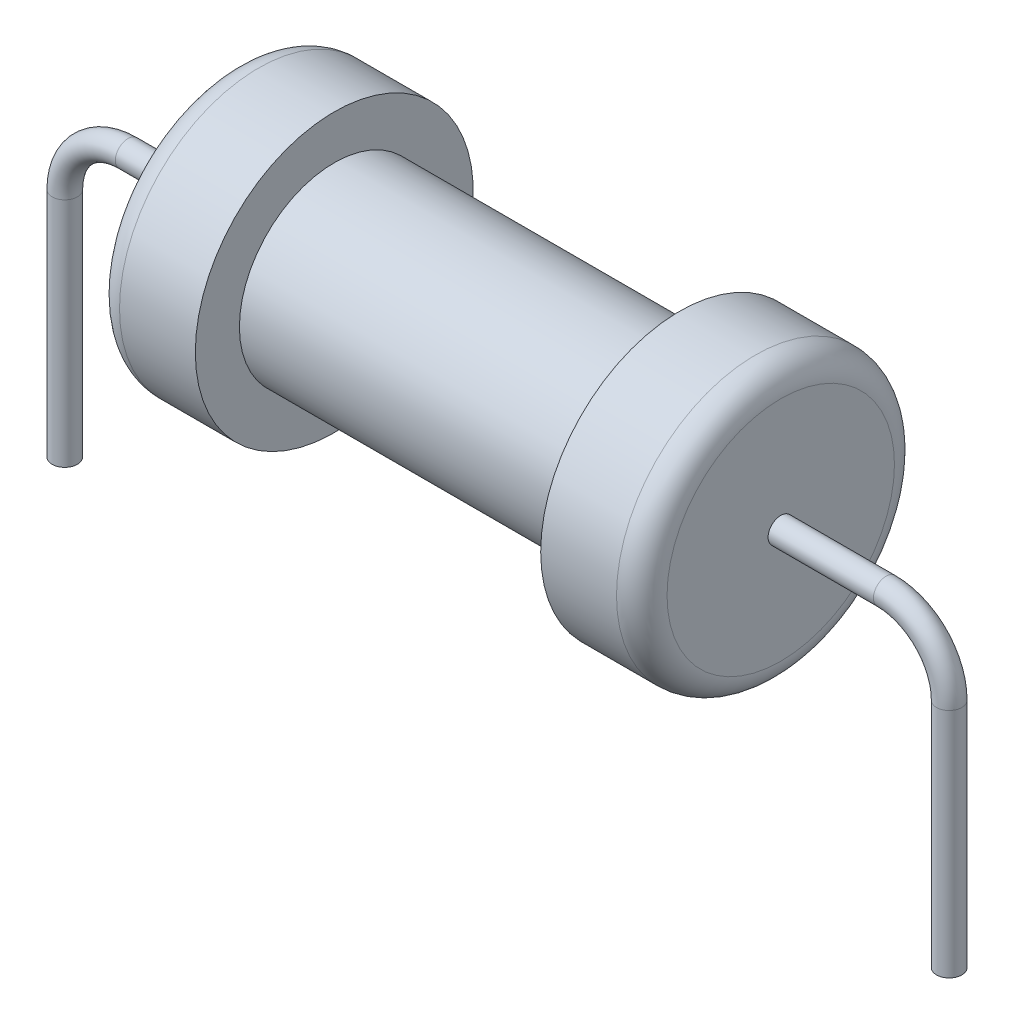
ISO-10303-21;
HEADER;
FILE_DESCRIPTION(('STEP AP214'),'2;1');
FILE_NAME('part.step','',(''),(''),'','','');
FILE_SCHEMA(('AUTOMOTIVE_DESIGN { 1 0 10303 214 1 1 1 1 }'));
ENDSEC;
DATA;
#1=APPLICATION_CONTEXT('core data for automotive mechanical design processes');
#2=APPLICATION_PROTOCOL_DEFINITION('international standard','automotive_design',2000,#1);
#3=PRODUCT_CONTEXT('',#1,'mechanical');
#4=PRODUCT('Part','Part','',(#3));
#5=PRODUCT_RELATED_PRODUCT_CATEGORY('part','',(#4));
#6=PRODUCT_DEFINITION_FORMATION('','',#4);
#7=PRODUCT_DEFINITION_CONTEXT('part definition',#1,'design');
#8=PRODUCT_DEFINITION('design','',#6,#7);
#9=PRODUCT_DEFINITION_SHAPE('','',#8);
#10=(LENGTH_UNIT() NAMED_UNIT(*) SI_UNIT(.MILLI.,.METRE.));
#11=(NAMED_UNIT(*) PLANE_ANGLE_UNIT() SI_UNIT($,.RADIAN.));
#12=(NAMED_UNIT(*) SI_UNIT($,.STERADIAN.) SOLID_ANGLE_UNIT());
#13=UNCERTAINTY_MEASURE_WITH_UNIT(LENGTH_MEASURE(1.E-05),#10,'distance_accuracy_value','');
#14=(GEOMETRIC_REPRESENTATION_CONTEXT(3) GLOBAL_UNCERTAINTY_ASSIGNED_CONTEXT((#13)) GLOBAL_UNIT_ASSIGNED_CONTEXT((#10,
#11,#12)) REPRESENTATION_CONTEXT('',''));
#15=CARTESIAN_POINT('',(0.,0.,0.));
#16=DIRECTION('',(0.,0.,1.));
#17=DIRECTION('',(1.,0.,0.));
#18=AXIS2_PLACEMENT_3D('',#15,#16,#17);
#19=CARTESIAN_POINT('',(4100.,0.,-5.51747200116744E-13));
#20=DIRECTION('',(1.,0.,0.));
#21=DIRECTION('',(0.,0.,-1.));
#22=AXIS2_PLACEMENT_3D('',#19,#20,#21);
#23=PLANE('',#22);
#24=CARTESIAN_POINT('',(4100.,0.,0.));
#25=DIRECTION('',(-1.,0.,0.));
#26=DIRECTION('',(0.,0.,1.));
#27=AXIS2_PLACEMENT_3D('',#24,#25,#26);
#28=CIRCLE('',#27,2253.28534690521);
#29=CARTESIAN_POINT('',(4100.,0.,2253.28534690521));
#30=VERTEX_POINT('',#29);
#31=EDGE_CURVE('E12',#30,#30,#28,.T.);
#32=ORIENTED_EDGE('',*,*,#31,.F.);
#33=EDGE_LOOP('',(#32));
#34=FACE_BOUND('',#33,.T.);
#35=CARTESIAN_POINT('',(4100.,0.,0.));
#36=DIRECTION('',(-1.,0.,0.));
#37=DIRECTION('',(0.,0.,1.));
#38=AXIS2_PLACEMENT_3D('',#35,#36,#37);
#39=CIRCLE('',#38,3300.);
#40=CARTESIAN_POINT('',(4100.,0.,3300.));
#41=VERTEX_POINT('',#40);
#42=EDGE_CURVE('E109',#41,#41,#39,.T.);
#43=ORIENTED_EDGE('',*,*,#42,.T.);
#44=EDGE_LOOP('',(#43));
#45=FACE_BOUND('',#44,.T.);
#46=ADVANCED_FACE('F74',(#34,#45),#23,.F.);
#47=CARTESIAN_POINT('',(-12281.1184678323,0.,0.));
#48=DIRECTION('',(-1.,0.,0.));
#49=DIRECTION('',(0.,0.,1.));
#50=AXIS2_PLACEMENT_3D('',#47,#48,#49);
#51=CYLINDRICAL_SURFACE('',#50,2253.28534690521);
#52=CARTESIAN_POINT('',(-4100.,0.,0.));
#53=DIRECTION('',(-1.,0.,0.));
#54=DIRECTION('',(0.,0.,1.));
#55=AXIS2_PLACEMENT_3D('',#52,#53,#54);
#56=CIRCLE('',#55,2253.28534690521);
#57=CARTESIAN_POINT('',(-4100.,0.,2253.28534690521));
#58=VERTEX_POINT('',#57);
#59=EDGE_CURVE('E81',#58,#58,#56,.T.);
#60=ORIENTED_EDGE('',*,*,#59,.F.);
#61=EDGE_LOOP('',(#60));
#62=FACE_BOUND('',#61,.T.);
#63=ORIENTED_EDGE('',*,*,#31,.T.);
#64=EDGE_LOOP('',(#63));
#65=FACE_BOUND('',#64,.T.);
#66=ADVANCED_FACE('F138',(#62,#65),#51,.T.);
#67=CARTESIAN_POINT('',(-4100.,0.,5.51747200116745E-13));
#68=DIRECTION('',(1.,0.,0.));
#69=DIRECTION('',(0.,0.,-1.));
#70=AXIS2_PLACEMENT_3D('',#67,#68,#69);
#71=PLANE('',#70);
#72=ORIENTED_EDGE('',*,*,#59,.T.);
#73=EDGE_LOOP('',(#72));
#74=FACE_BOUND('',#73,.T.);
#75=CARTESIAN_POINT('',(-4100.,0.,0.));
#76=DIRECTION('',(-1.,0.,0.));
#77=DIRECTION('',(0.,0.,1.));
#78=AXIS2_PLACEMENT_3D('',#75,#76,#77);
#79=CIRCLE('',#78,3300.);
#80=CARTESIAN_POINT('',(-4100.,0.,3300.));
#81=VERTEX_POINT('',#80);
#82=EDGE_CURVE('E86',#81,#81,#79,.T.);
#83=ORIENTED_EDGE('',*,*,#82,.F.);
#84=EDGE_LOOP('',(#83));
#85=FACE_BOUND('',#84,.T.);
#86=ADVANCED_FACE('F143',(#74,#85),#71,.T.);
#87=CARTESIAN_POINT('',(-12281.1184678323,0.,0.));
#88=DIRECTION('',(-1.,0.,0.));
#89=DIRECTION('',(0.,0.,1.));
#90=AXIS2_PLACEMENT_3D('',#87,#88,#89);
#91=CYLINDRICAL_SURFACE('',#90,3300.);
#92=ORIENTED_EDGE('',*,*,#82,.T.);
#93=EDGE_LOOP('',(#92));
#94=FACE_BOUND('',#93,.T.);
#95=CARTESIAN_POINT('',(-5900.,0.,0.));
#96=DIRECTION('',(-1.,0.,0.));
#97=DIRECTION('',(0.,0.,1.));
#98=AXIS2_PLACEMENT_3D('',#95,#96,#97);
#99=CIRCLE('',#98,3300.);
#100=CARTESIAN_POINT('',(-5900.,0.,3300.));
#101=VERTEX_POINT('',#100);
#102=EDGE_CURVE('E91',#101,#101,#99,.T.);
#103=ORIENTED_EDGE('',*,*,#102,.F.);
#104=EDGE_LOOP('',(#103));
#105=FACE_BOUND('',#104,.T.);
#106=ADVANCED_FACE('F148',(#94,#105),#91,.T.);
#107=CARTESIAN_POINT('',(-5900.,0.,0.));
#108=DIRECTION('',(-1.,0.,0.));
#109=DIRECTION('',(0.,0.,1.));
#110=AXIS2_PLACEMENT_3D('',#107,#108,#109);
#111=TOROIDAL_SURFACE('',#110,2700.,600.);
#112=ORIENTED_EDGE('',*,*,#102,.T.);
#113=EDGE_LOOP('',(#112));
#114=FACE_BOUND('',#113,.T.);
#115=CARTESIAN_POINT('',(-6500.,0.,0.));
#116=DIRECTION('',(-1.,0.,0.));
#117=DIRECTION('',(0.,0.,1.));
#118=AXIS2_PLACEMENT_3D('',#115,#116,#117);
#119=CIRCLE('',#118,2699.99999999999);
#120=CARTESIAN_POINT('',(-6500.,0.,2699.99999999999));
#121=VERTEX_POINT('',#120);
#122=EDGE_CURVE('E97',#121,#121,#119,.T.);
#123=ORIENTED_EDGE('',*,*,#122,.F.);
#124=EDGE_LOOP('',(#123));
#125=FACE_BOUND('',#124,.T.);
#126=ADVANCED_FACE('F134',(#114,#125),#111,.T.);
#127=CARTESIAN_POINT('',(-6500.,0.,1.06910365334275E-12));
#128=DIRECTION('',(1.,0.,0.));
#129=DIRECTION('',(0.,0.,-1.));
#130=AXIS2_PLACEMENT_3D('',#127,#128,#129);
#131=PLANE('',#130);
#132=ORIENTED_EDGE('',*,*,#122,.T.);
#133=EDGE_LOOP('',(#132));
#134=FACE_BOUND('',#133,.T.);
#135=ADVANCED_FACE('F129',(#134),#131,.F.);
#136=CARTESIAN_POINT('',(6500.,0.,0.));
#137=DIRECTION('',(-1.,0.,0.));
#138=DIRECTION('',(0.,0.,1.));
#139=AXIS2_PLACEMENT_3D('',#136,#137,#138);
#140=PLANE('',#139);
#141=CARTESIAN_POINT('',(6500.,0.,0.));
#142=DIRECTION('',(-1.,0.,0.));
#143=DIRECTION('',(0.,0.,1.));
#144=AXIS2_PLACEMENT_3D('',#141,#142,#143);
#145=CIRCLE('',#144,2699.99999999999);
#146=CARTESIAN_POINT('',(6500.,0.,2699.99999999999));
#147=VERTEX_POINT('',#146);
#148=EDGE_CURVE('E101',#147,#147,#145,.T.);
#149=ORIENTED_EDGE('',*,*,#148,.F.);
#150=EDGE_LOOP('',(#149));
#151=FACE_BOUND('',#150,.T.);
#152=ADVANCED_FACE('F124',(#151),#140,.F.);
#153=CARTESIAN_POINT('',(5900.,0.,0.));
#154=DIRECTION('',(-1.,0.,0.));
#155=DIRECTION('',(0.,0.,1.));
#156=AXIS2_PLACEMENT_3D('',#153,#154,#155);
#157=TOROIDAL_SURFACE('',#156,2700.,600.);
#158=CARTESIAN_POINT('',(5900.,0.,0.));
#159=DIRECTION('',(-1.,0.,0.));
#160=DIRECTION('',(0.,0.,1.));
#161=AXIS2_PLACEMENT_3D('',#158,#159,#160);
#162=CIRCLE('',#161,3300.);
#163=CARTESIAN_POINT('',(5900.,0.,3300.));
#164=VERTEX_POINT('',#163);
#165=EDGE_CURVE('E105',#164,#164,#162,.T.);
#166=ORIENTED_EDGE('',*,*,#165,.F.);
#167=EDGE_LOOP('',(#166));
#168=FACE_BOUND('',#167,.T.);
#169=ORIENTED_EDGE('',*,*,#148,.T.);
#170=EDGE_LOOP('',(#169));
#171=FACE_BOUND('',#170,.T.);
#172=ADVANCED_FACE('F118',(#168,#171),#157,.T.);
#173=CARTESIAN_POINT('',(-12281.1184678323,0.,0.));
#174=DIRECTION('',(-1.,0.,0.));
#175=DIRECTION('',(0.,0.,1.));
#176=AXIS2_PLACEMENT_3D('',#173,#174,#175);
#177=CYLINDRICAL_SURFACE('',#176,3300.);
#178=ORIENTED_EDGE('',*,*,#42,.F.);
#179=EDGE_LOOP('',(#178));
#180=FACE_BOUND('',#179,.T.);
#181=ORIENTED_EDGE('',*,*,#165,.T.);
#182=EDGE_LOOP('',(#181));
#183=FACE_BOUND('',#182,.T.);
#184=ADVANCED_FACE('F115',(#180,#183),#177,.T.);
#185=CLOSED_SHELL('',(#46,#66,#86,#106,#126,#135,#152,#172,#184));
#186=MANIFOLD_SOLID_BREP('B2',#185);
#187=CARTESIAN_POINT('',(-6499.25397283039,0.,0.));
#188=DIRECTION('',(1.,0.,0.));
#189=DIRECTION('',(0.,0.,1.));
#190=AXIS2_PLACEMENT_3D('',#187,#188,#189);
#191=PLANE('',#190);
#192=CARTESIAN_POINT('',(-6499.25397283039,0.,0.));
#193=DIRECTION('',(1.,0.,0.));
#194=DIRECTION('',(0.,0.,1.));
#195=AXIS2_PLACEMENT_3D('',#192,#193,#194);
#196=CIRCLE('',#195,300.000000000001);
#197=CARTESIAN_POINT('',(-6499.25397283039,0.,300.000000000001));
#198=VERTEX_POINT('',#197);
#199=EDGE_CURVE('E234',#198,#198,#196,.T.);
#200=ORIENTED_EDGE('',*,*,#199,.T.);
#201=EDGE_LOOP('',(#200));
#202=FACE_BOUND('',#201,.T.);
#203=ADVANCED_FACE('F220',(#202),#191,.T.);
#204=CARTESIAN_POINT('',(-10499.2539728304,-7000.,0.));
#205=DIRECTION('',(0.,1.,0.));
#206=DIRECTION('',(0.,0.,1.));
#207=AXIS2_PLACEMENT_3D('',#204,#205,#206);
#208=PLANE('',#207);
#209=CARTESIAN_POINT('',(-10499.2539728304,-7000.,0.));
#210=DIRECTION('',(0.,1.,0.));
#211=DIRECTION('',(0.,0.,1.));
#212=AXIS2_PLACEMENT_3D('',#209,#210,#211);
#213=CIRCLE('',#212,300.000000000001);
#214=CARTESIAN_POINT('',(-10499.2539728304,-7000.,300.000000000001));
#215=VERTEX_POINT('',#214);
#216=EDGE_CURVE('E73',#215,#215,#213,.T.);
#217=ORIENTED_EDGE('',*,*,#216,.F.);
#218=EDGE_LOOP('',(#217));
#219=FACE_BOUND('',#218,.T.);
#220=ADVANCED_FACE('F244',(#219),#208,.F.);
#221=CARTESIAN_POINT('',(-6499.25397283039,0.,0.));
#222=DIRECTION('',(-1.,0.,0.));
#223=DIRECTION('',(0.,0.,1.));
#224=AXIS2_PLACEMENT_3D('',#221,#222,#223);
#225=CYLINDRICAL_SURFACE('',#224,300.000000000001);
#226=CARTESIAN_POINT('',(-8999.25397283039,0.,0.));
#227=DIRECTION('',(1.,0.,0.));
#228=DIRECTION('',(0.,0.,1.));
#229=AXIS2_PLACEMENT_3D('',#226,#227,#228);
#230=CIRCLE('',#229,300.000000000001);
#231=CARTESIAN_POINT('',(-8999.25397283039,300.000000000001,0.));
#232=VERTEX_POINT('',#231);
#233=EDGE_CURVE('E230',#232,#232,#230,.T.);
#234=ORIENTED_EDGE('',*,*,#233,.T.);
#235=EDGE_LOOP('',(#234));
#236=FACE_BOUND('',#235,.T.);
#237=ORIENTED_EDGE('',*,*,#199,.F.);
#238=EDGE_LOOP('',(#237));
#239=FACE_BOUND('',#238,.T.);
#240=ADVANCED_FACE('F241',(#236,#239),#225,.T.);
#241=CARTESIAN_POINT('',(-8999.25397283039,-1500.,0.));
#242=DIRECTION('',(0.,0.,1.));
#243=DIRECTION('',(1.,0.,0.));
#244=AXIS2_PLACEMENT_3D('',#241,#242,#243);
#245=TOROIDAL_SURFACE('',#244,1500.,300.000000000001);
#246=CARTESIAN_POINT('',(-10499.2539728304,-1500.,0.));
#247=DIRECTION('',(0.,1.,0.));
#248=DIRECTION('',(0.,0.,1.));
#249=AXIS2_PLACEMENT_3D('',#246,#247,#248);
#250=CIRCLE('',#249,300.000000000001);
#251=CARTESIAN_POINT('',(-10799.2539728304,-1500.,0.));
#252=VERTEX_POINT('',#251);
#253=EDGE_CURVE('E226',#252,#252,#250,.T.);
#254=CARTESIAN_POINT('',(-8999.25397283039,-1500.,0.));
#255=DIRECTION('',(0.,0.,1.));
#256=DIRECTION('',(1.,0.,0.));
#257=AXIS2_PLACEMENT_3D('',#254,#255,#256);
#258=CIRCLE('',#257,1800.);
#259=EDGE_CURVE('',#232,#252,#258,.T.);
#260=ORIENTED_EDGE('',*,*,#233,.F.);
#261=ORIENTED_EDGE('',*,*,#253,.T.);
#262=ORIENTED_EDGE('',*,*,#259,.T.);
#263=ORIENTED_EDGE('',*,*,#259,.F.);
#264=EDGE_LOOP('',(#260,#262,#261,#263));
#265=FACE_BOUND('',#264,.T.);
#266=ADVANCED_FACE('F243',(#265),#245,.T.);
#267=CARTESIAN_POINT('',(-10499.2539728304,-1500.,0.));
#268=DIRECTION('',(0.,-1.,0.));
#269=DIRECTION('',(0.,0.,-1.));
#270=AXIS2_PLACEMENT_3D('',#267,#268,#269);
#271=CYLINDRICAL_SURFACE('',#270,300.000000000001);
#272=ORIENTED_EDGE('',*,*,#216,.T.);
#273=EDGE_LOOP('',(#272));
#274=FACE_BOUND('',#273,.T.);
#275=ORIENTED_EDGE('',*,*,#253,.F.);
#276=EDGE_LOOP('',(#275));
#277=FACE_BOUND('',#276,.T.);
#278=ADVANCED_FACE('F251',(#274,#277),#271,.T.);
#279=CLOSED_SHELL('',(#203,#220,#240,#266,#278));
#280=MANIFOLD_SOLID_BREP('B7',#279);
#281=CARTESIAN_POINT('',(10500.,-7000.,0.));
#282=DIRECTION('',(0.,-1.,0.));
#283=DIRECTION('',(1.,0.,0.));
#284=AXIS2_PLACEMENT_3D('',#281,#282,#283);
#285=PLANE('',#284);
#286=CARTESIAN_POINT('',(10500.,-7000.,0.));
#287=DIRECTION('',(0.,-1.,0.));
#288=DIRECTION('',(1.,0.,0.));
#289=AXIS2_PLACEMENT_3D('',#286,#287,#288);
#290=CIRCLE('',#289,300.);
#291=CARTESIAN_POINT('',(10800.,-7000.,0.));
#292=VERTEX_POINT('',#291);
#293=EDGE_CURVE('E305',#292,#292,#290,.T.);
#294=ORIENTED_EDGE('',*,*,#293,.T.);
#295=EDGE_LOOP('',(#294));
#296=FACE_BOUND('',#295,.T.);
#297=ADVANCED_FACE('F291',(#296),#285,.T.);
#298=CARTESIAN_POINT('',(6500.,2.22044604925031E-13,0.));
#299=DIRECTION('',(1.,0.,0.));
#300=DIRECTION('',(0.,1.,0.));
#301=AXIS2_PLACEMENT_3D('',#298,#299,#300);
#302=PLANE('',#301);
#303=CARTESIAN_POINT('',(6500.,2.22044604925031E-13,0.));
#304=DIRECTION('',(1.,0.,0.));
#305=DIRECTION('',(0.,1.,0.));
#306=AXIS2_PLACEMENT_3D('',#303,#304,#305);
#307=CIRCLE('',#306,300.);
#308=CARTESIAN_POINT('',(6500.,300.,0.));
#309=VERTEX_POINT('',#308);
#310=EDGE_CURVE('E219',#309,#309,#307,.T.);
#311=ORIENTED_EDGE('',*,*,#310,.F.);
#312=EDGE_LOOP('',(#311));
#313=FACE_BOUND('',#312,.T.);
#314=ADVANCED_FACE('F315',(#313),#302,.F.);
#315=CARTESIAN_POINT('',(10500.,-7000.,0.));
#316=DIRECTION('',(0.,1.,0.));
#317=DIRECTION('',(0.,0.,1.));
#318=AXIS2_PLACEMENT_3D('',#315,#316,#317);
#319=CYLINDRICAL_SURFACE('',#318,300.);
#320=CARTESIAN_POINT('',(10500.,-1500.,0.));
#321=DIRECTION('',(0.,-1.,0.));
#322=DIRECTION('',(1.,0.,0.));
#323=AXIS2_PLACEMENT_3D('',#320,#321,#322);
#324=CIRCLE('',#323,300.);
#325=CARTESIAN_POINT('',(10800.,-1500.,0.));
#326=VERTEX_POINT('',#325);
#327=EDGE_CURVE('E301',#326,#326,#324,.T.);
#328=ORIENTED_EDGE('',*,*,#327,.T.);
#329=EDGE_LOOP('',(#328));
#330=FACE_BOUND('',#329,.T.);
#331=ORIENTED_EDGE('',*,*,#293,.F.);
#332=EDGE_LOOP('',(#331));
#333=FACE_BOUND('',#332,.T.);
#334=ADVANCED_FACE('F312',(#330,#333),#319,.T.);
#335=CARTESIAN_POINT('',(9000.,-1500.,0.));
#336=DIRECTION('',(0.,0.,1.));
#337=DIRECTION('',(1.,0.,0.));
#338=AXIS2_PLACEMENT_3D('',#335,#336,#337);
#339=TOROIDAL_SURFACE('',#338,1500.,300.);
#340=CARTESIAN_POINT('',(9000.,1.02140518265514E-12,0.));
#341=DIRECTION('',(1.,0.,0.));
#342=DIRECTION('',(0.,1.,0.));
#343=AXIS2_PLACEMENT_3D('',#340,#341,#342);
#344=CIRCLE('',#343,300.);
#345=CARTESIAN_POINT('',(9000.,300.000000000001,0.));
#346=VERTEX_POINT('',#345);
#347=EDGE_CURVE('E297',#346,#346,#344,.T.);
#348=CARTESIAN_POINT('',(9000.,-1500.,0.));
#349=DIRECTION('',(0.,0.,1.));
#350=DIRECTION('',(1.,0.,0.));
#351=AXIS2_PLACEMENT_3D('',#348,#349,#350);
#352=CIRCLE('',#351,1800.);
#353=EDGE_CURVE('',#326,#346,#352,.T.);
#354=ORIENTED_EDGE('',*,*,#327,.F.);
#355=ORIENTED_EDGE('',*,*,#347,.T.);
#356=ORIENTED_EDGE('',*,*,#353,.T.);
#357=ORIENTED_EDGE('',*,*,#353,.F.);
#358=EDGE_LOOP('',(#354,#356,#355,#357));
#359=FACE_BOUND('',#358,.T.);
#360=ADVANCED_FACE('F314',(#359),#339,.T.);
#361=CARTESIAN_POINT('',(9000.,4.44089209850063E-13,0.));
#362=DIRECTION('',(-1.,0.,0.));
#363=DIRECTION('',(0.,-1.,0.));
#364=AXIS2_PLACEMENT_3D('',#361,#362,#363);
#365=CYLINDRICAL_SURFACE('',#364,300.);
#366=ORIENTED_EDGE('',*,*,#310,.T.);
#367=EDGE_LOOP('',(#366));
#368=FACE_BOUND('',#367,.T.);
#369=ORIENTED_EDGE('',*,*,#347,.F.);
#370=EDGE_LOOP('',(#369));
#371=FACE_BOUND('',#370,.T.);
#372=ADVANCED_FACE('F322',(#368,#371),#365,.T.);
#373=CLOSED_SHELL('',(#297,#314,#334,#360,#372));
#374=MANIFOLD_SOLID_BREP('B68',#373);
#375=ADVANCED_BREP_SHAPE_REPRESENTATION('',(#18,#186,#280,#374),#14);
#376=SHAPE_DEFINITION_REPRESENTATION(#9,#375);
ENDSEC;
END-ISO-10303-21;
